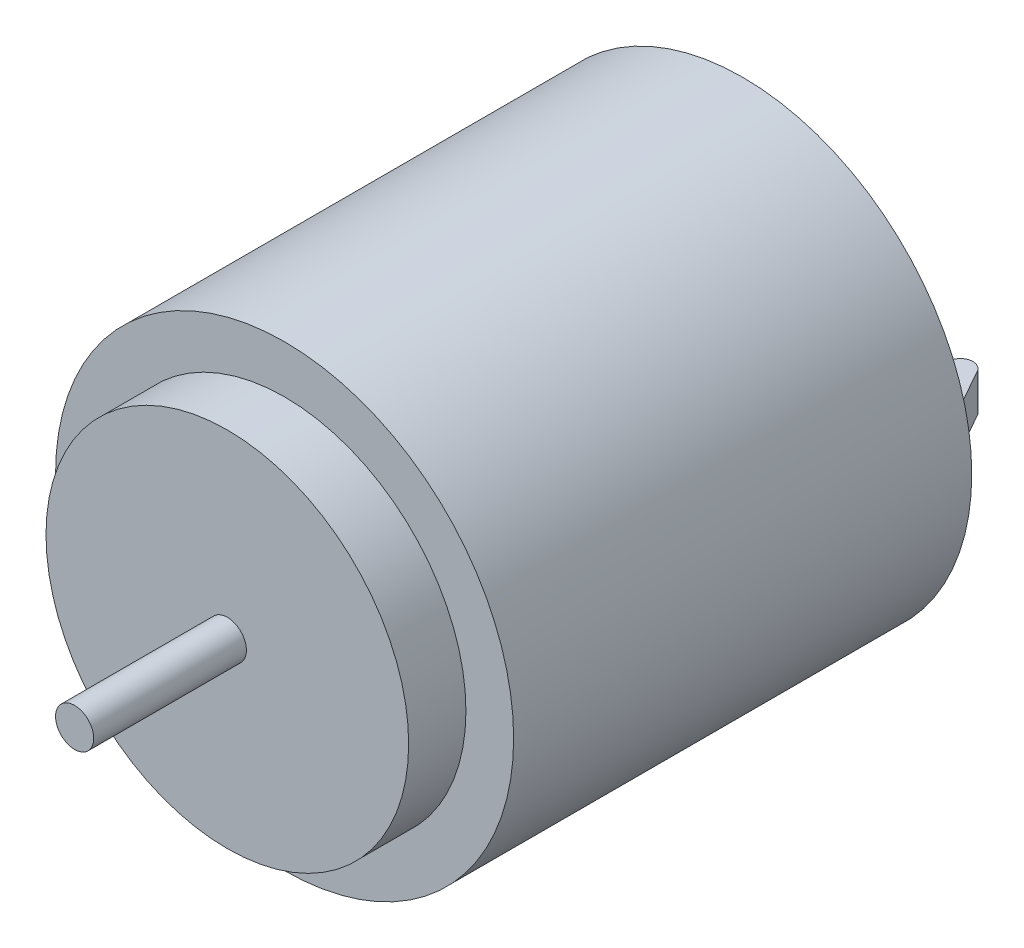
ISO-10303-21;
HEADER;
FILE_DESCRIPTION(('STEP AP214'),'2;1');
FILE_NAME('part.step','',(''),(''),'','','');
FILE_SCHEMA(('AUTOMOTIVE_DESIGN { 1 0 10303 214 1 1 1 1 }'));
ENDSEC;
DATA;
#1=APPLICATION_CONTEXT('core data for automotive mechanical design processes');
#2=APPLICATION_PROTOCOL_DEFINITION('international standard','automotive_design',2000,#1);
#3=PRODUCT_CONTEXT('',#1,'mechanical');
#4=PRODUCT('Part','Part','',(#3));
#5=PRODUCT_RELATED_PRODUCT_CATEGORY('part','',(#4));
#6=PRODUCT_DEFINITION_FORMATION('','',#4);
#7=PRODUCT_DEFINITION_CONTEXT('part definition',#1,'design');
#8=PRODUCT_DEFINITION('design','',#6,#7);
#9=PRODUCT_DEFINITION_SHAPE('','',#8);
#10=(LENGTH_UNIT() NAMED_UNIT(*) SI_UNIT(.MILLI.,.METRE.));
#11=(NAMED_UNIT(*) PLANE_ANGLE_UNIT() SI_UNIT($,.RADIAN.));
#12=(NAMED_UNIT(*) SI_UNIT($,.STERADIAN.) SOLID_ANGLE_UNIT());
#13=UNCERTAINTY_MEASURE_WITH_UNIT(LENGTH_MEASURE(1.E-05),#10,'distance_accuracy_value','');
#14=(GEOMETRIC_REPRESENTATION_CONTEXT(3) GLOBAL_UNCERTAINTY_ASSIGNED_CONTEXT((#13)) GLOBAL_UNIT_ASSIGNED_CONTEXT((#10,
#11,#12)) REPRESENTATION_CONTEXT('',''));
#15=CARTESIAN_POINT('',(0.,0.,0.));
#16=DIRECTION('',(0.,0.,1.));
#17=DIRECTION('',(1.,0.,0.));
#18=AXIS2_PLACEMENT_3D('',#15,#16,#17);
#19=CARTESIAN_POINT('',(0.,0.,-15.6068218615443));
#20=DIRECTION('',(0.,0.,-1.));
#21=DIRECTION('',(-1.,0.,0.));
#22=AXIS2_PLACEMENT_3D('',#19,#20,#21);
#23=PLANE('',#22);
#24=DIRECTION('',(1.,0.,0.));
#25=VECTOR('',#24,1.);
#26=CARTESIAN_POINT('',(0.,1.,-15.6068218615443));
#27=LINE('',#26,#25);
#28=CARTESIAN_POINT('',(9.11430818320881,1.,-15.6068218615443));
#29=VERTEX_POINT('',#28);
#30=CARTESIAN_POINT('',(10.5082613397607,1.,-15.6068218615443));
#31=VERTEX_POINT('',#30);
#32=EDGE_CURVE('E196',#29,#31,#27,.T.);
#33=ORIENTED_EDGE('',*,*,#32,.F.);
#34=DIRECTION('',(0.,-1.,0.));
#35=VECTOR('',#34,1.);
#36=CARTESIAN_POINT('',(9.11430818320881,0.,-15.6068218615443));
#37=LINE('',#36,#35);
#38=CARTESIAN_POINT('',(9.11430818320881,-1.,-15.6068218615443));
#39=VERTEX_POINT('',#38);
#40=EDGE_CURVE('E190',#29,#39,#37,.T.);
#41=ORIENTED_EDGE('',*,*,#40,.T.);
#42=DIRECTION('',(1.,0.,0.));
#43=VECTOR('',#42,1.);
#44=CARTESIAN_POINT('',(0.,-1.,-15.6068218615443));
#45=LINE('',#44,#43);
#46=CARTESIAN_POINT('',(10.5082613397607,-1.,-15.6068218615443));
#47=VERTEX_POINT('',#46);
#48=EDGE_CURVE('E187',#39,#47,#45,.T.);
#49=ORIENTED_EDGE('',*,*,#48,.T.);
#50=DIRECTION('',(0.,-1.,0.));
#51=VECTOR('',#50,1.);
#52=CARTESIAN_POINT('',(10.5082613397607,1.,-15.6068218615443));
#53=LINE('',#52,#51);
#54=EDGE_CURVE('E193',#47,#31,#53,.F.);
#55=ORIENTED_EDGE('',*,*,#54,.T.);
#56=EDGE_LOOP('',(#33,#41,#49,#55));
#57=FACE_BOUND('',#56,.T.);
#58=CARTESIAN_POINT('',(0.,0.,-15.6068218615443));
#59=DIRECTION('',(0.,0.,1.));
#60=DIRECTION('',(1.,0.,0.));
#61=AXIS2_PLACEMENT_3D('',#58,#59,#60);
#62=CIRCLE('',#61,12.);
#63=CARTESIAN_POINT('',(12.,0.,-15.6068218615443));
#64=VERTEX_POINT('',#63);
#65=EDGE_CURVE('E184',#64,#64,#62,.T.);
#66=ORIENTED_EDGE('',*,*,#65,.F.);
#67=EDGE_LOOP('',(#66));
#68=FACE_BOUND('',#67,.T.);
#69=DIRECTION('',(0.,1.,0.));
#70=VECTOR('',#69,1.);
#71=CARTESIAN_POINT('',(-9.11430818320881,0.,-15.6068218615443));
#72=LINE('',#71,#70);
#73=CARTESIAN_POINT('',(-9.11430818320881,-1.,-15.6068218615443));
#74=VERTEX_POINT('',#73);
#75=CARTESIAN_POINT('',(-9.11430818320881,1.,-15.6068218615443));
#76=VERTEX_POINT('',#75);
#77=EDGE_CURVE('E49',#74,#76,#72,.T.);
#78=ORIENTED_EDGE('',*,*,#77,.T.);
#79=DIRECTION('',(-1.,0.,0.));
#80=VECTOR('',#79,1.);
#81=CARTESIAN_POINT('',(0.,1.,-15.6068218615443));
#82=LINE('',#81,#80);
#83=CARTESIAN_POINT('',(-10.5082613397607,1.,-15.6068218615443));
#84=VERTEX_POINT('',#83);
#85=EDGE_CURVE('E11',#76,#84,#82,.T.);
#86=ORIENTED_EDGE('',*,*,#85,.T.);
#87=DIRECTION('',(0.,-1.,0.));
#88=VECTOR('',#87,1.);
#89=CARTESIAN_POINT('',(-10.5082613397607,1.,-15.6068218615443));
#90=LINE('',#89,#88);
#91=CARTESIAN_POINT('',(-10.5082613397607,-1.,-15.6068218615443));
#92=VERTEX_POINT('',#91);
#93=EDGE_CURVE('E39',#84,#92,#90,.T.);
#94=ORIENTED_EDGE('',*,*,#93,.T.);
#95=DIRECTION('',(-1.,0.,0.));
#96=VECTOR('',#95,1.);
#97=CARTESIAN_POINT('',(0.,-1.,-15.6068218615443));
#98=LINE('',#97,#96);
#99=EDGE_CURVE('E198',#74,#92,#98,.T.);
#100=ORIENTED_EDGE('',*,*,#99,.F.);
#101=EDGE_LOOP('',(#78,#86,#94,#100));
#102=FACE_BOUND('',#101,.T.);
#103=ADVANCED_FACE('F32',(#57,#68,#102),#23,.T.);
#104=CARTESIAN_POINT('',(0.,0.,19.3931781384557));
#105=DIRECTION('',(0.,0.,1.));
#106=DIRECTION('',(1.,0.,0.));
#107=AXIS2_PLACEMENT_3D('',#104,#105,#106);
#108=CYLINDRICAL_SURFACE('',#107,12.);
#109=ORIENTED_EDGE('',*,*,#65,.T.);
#110=EDGE_LOOP('',(#109));
#111=FACE_BOUND('',#110,.T.);
#112=CARTESIAN_POINT('',(0.,0.,8.39317813845566));
#113=DIRECTION('',(0.,0.,1.));
#114=DIRECTION('',(1.,0.,0.));
#115=AXIS2_PLACEMENT_3D('',#112,#113,#114);
#116=CIRCLE('',#115,12.);
#117=CARTESIAN_POINT('',(12.,0.,8.39317813845566));
#118=VERTEX_POINT('',#117);
#119=EDGE_CURVE('E181',#118,#118,#116,.T.);
#120=ORIENTED_EDGE('',*,*,#119,.F.);
#121=EDGE_LOOP('',(#120));
#122=FACE_BOUND('',#121,.T.);
#123=ADVANCED_FACE('F221',(#111,#122),#108,.T.);
#124=CARTESIAN_POINT('',(12.,0.,8.39317813845566));
#125=DIRECTION('',(0.,0.,1.));
#126=DIRECTION('',(1.,0.,0.));
#127=AXIS2_PLACEMENT_3D('',#124,#125,#126);
#128=PLANE('',#127);
#129=ORIENTED_EDGE('',*,*,#119,.T.);
#130=EDGE_LOOP('',(#129));
#131=FACE_BOUND('',#130,.T.);
#132=CARTESIAN_POINT('',(0.,0.,8.39317813845566));
#133=DIRECTION('',(0.,0.,1.));
#134=DIRECTION('',(1.,0.,0.));
#135=AXIS2_PLACEMENT_3D('',#132,#133,#134);
#136=CIRCLE('',#135,9.50000000000001);
#137=CARTESIAN_POINT('',(9.50000000000001,0.,8.39317813845566));
#138=VERTEX_POINT('',#137);
#139=EDGE_CURVE('E178',#138,#138,#136,.T.);
#140=ORIENTED_EDGE('',*,*,#139,.F.);
#141=EDGE_LOOP('',(#140));
#142=FACE_BOUND('',#141,.T.);
#143=ADVANCED_FACE('F226',(#131,#142),#128,.T.);
#144=CARTESIAN_POINT('',(0.,0.,19.3931781384557));
#145=DIRECTION('',(0.,0.,1.));
#146=DIRECTION('',(1.,0.,0.));
#147=AXIS2_PLACEMENT_3D('',#144,#145,#146);
#148=CYLINDRICAL_SURFACE('',#147,9.50000000000001);
#149=ORIENTED_EDGE('',*,*,#139,.T.);
#150=EDGE_LOOP('',(#149));
#151=FACE_BOUND('',#150,.T.);
#152=CARTESIAN_POINT('',(0.,0.,11.3931781384557));
#153=DIRECTION('',(0.,0.,1.));
#154=DIRECTION('',(1.,0.,0.));
#155=AXIS2_PLACEMENT_3D('',#152,#153,#154);
#156=CIRCLE('',#155,9.50000000000001);
#157=CARTESIAN_POINT('',(9.50000000000001,0.,11.3931781384557));
#158=VERTEX_POINT('',#157);
#159=EDGE_CURVE('E175',#158,#158,#156,.T.);
#160=ORIENTED_EDGE('',*,*,#159,.F.);
#161=EDGE_LOOP('',(#160));
#162=FACE_BOUND('',#161,.T.);
#163=ADVANCED_FACE('F236',(#151,#162),#148,.T.);
#164=CARTESIAN_POINT('',(9.50000000000001,0.,11.3931781384557));
#165=DIRECTION('',(0.,0.,1.));
#166=DIRECTION('',(1.,0.,0.));
#167=AXIS2_PLACEMENT_3D('',#164,#165,#166);
#168=PLANE('',#167);
#169=ORIENTED_EDGE('',*,*,#159,.T.);
#170=EDGE_LOOP('',(#169));
#171=FACE_BOUND('',#170,.T.);
#172=CARTESIAN_POINT('',(0.,0.,11.3931781384557));
#173=DIRECTION('',(0.,0.,1.));
#174=DIRECTION('',(1.,0.,0.));
#175=AXIS2_PLACEMENT_3D('',#172,#173,#174);
#176=CIRCLE('',#175,1.);
#177=CARTESIAN_POINT('',(1.,0.,11.3931781384557));
#178=VERTEX_POINT('',#177);
#179=EDGE_CURVE('E172',#178,#178,#176,.T.);
#180=ORIENTED_EDGE('',*,*,#179,.F.);
#181=EDGE_LOOP('',(#180));
#182=FACE_BOUND('',#181,.T.);
#183=ADVANCED_FACE('F242',(#171,#182),#168,.T.);
#184=CARTESIAN_POINT('',(0.,0.,19.3931781384557));
#185=DIRECTION('',(0.,0.,1.));
#186=DIRECTION('',(1.,0.,0.));
#187=AXIS2_PLACEMENT_3D('',#184,#185,#186);
#188=CYLINDRICAL_SURFACE('',#187,1.);
#189=ORIENTED_EDGE('',*,*,#179,.T.);
#190=EDGE_LOOP('',(#189));
#191=FACE_BOUND('',#190,.T.);
#192=CARTESIAN_POINT('',(0.,0.,19.3931781384557));
#193=DIRECTION('',(0.,0.,1.));
#194=DIRECTION('',(1.,0.,0.));
#195=AXIS2_PLACEMENT_3D('',#192,#193,#194);
#196=CIRCLE('',#195,1.);
#197=CARTESIAN_POINT('',(1.,0.,19.3931781384557));
#198=VERTEX_POINT('',#197);
#199=EDGE_CURVE('E169',#198,#198,#196,.T.);
#200=ORIENTED_EDGE('',*,*,#199,.F.);
#201=EDGE_LOOP('',(#200));
#202=FACE_BOUND('',#201,.T.);
#203=ADVANCED_FACE('F248',(#191,#202),#188,.T.);
#204=CARTESIAN_POINT('',(1.,0.,19.3931781384557));
#205=DIRECTION('',(0.,0.,1.));
#206=DIRECTION('',(1.,0.,0.));
#207=AXIS2_PLACEMENT_3D('',#204,#205,#206);
#208=PLANE('',#207);
#209=ORIENTED_EDGE('',*,*,#199,.T.);
#210=EDGE_LOOP('',(#209));
#211=FACE_BOUND('',#210,.T.);
#212=ADVANCED_FACE('F254',(#211),#208,.T.);
#213=CARTESIAN_POINT('',(9.85801024992546,1.,-15.6068218615443));
#214=DIRECTION('',(0.,-1.,0.));
#215=DIRECTION('',(0.,0.,-1.));
#216=AXIS2_PLACEMENT_3D('',#213,#214,#215);
#217=CYLINDRICAL_SURFACE('',#216,0.650251089835234);
#218=ORIENTED_EDGE('',*,*,#54,.F.);
#219=CARTESIAN_POINT('',(9.85801024992546,-1.,-15.6068218615443));
#220=DIRECTION('',(0.,1.,0.));
#221=DIRECTION('',(0.,0.,1.));
#222=AXIS2_PLACEMENT_3D('',#219,#220,#221);
#223=CIRCLE('',#222,0.650251089835234);
#224=CARTESIAN_POINT('',(10.4265530828083,-1.,-15.9223936077598));
#225=VERTEX_POINT('',#224);
#226=EDGE_CURVE('E120',#47,#225,#223,.T.);
#227=ORIENTED_EDGE('',*,*,#226,.T.);
#228=DIRECTION('',(0.,-1.,0.));
#229=VECTOR('',#228,1.);
#230=CARTESIAN_POINT('',(10.4265530828083,1.,-15.9223936077598));
#231=LINE('',#230,#229);
#232=CARTESIAN_POINT('',(10.4265530828083,1.,-15.9223936077598));
#233=VERTEX_POINT('',#232);
#234=EDGE_CURVE('E166',#233,#225,#231,.T.);
#235=ORIENTED_EDGE('',*,*,#234,.F.);
#236=CARTESIAN_POINT('',(9.85801024992546,1.,-15.6068218615443));
#237=DIRECTION('',(0.,1.,0.));
#238=DIRECTION('',(0.,0.,1.));
#239=AXIS2_PLACEMENT_3D('',#236,#237,#238);
#240=CIRCLE('',#239,0.650251089835234);
#241=EDGE_CURVE('E143',#31,#233,#240,.T.);
#242=ORIENTED_EDGE('',*,*,#241,.F.);
#243=EDGE_LOOP('',(#218,#227,#235,#242));
#244=FACE_BOUND('',#243,.T.);
#245=ADVANCED_FACE('F259',(#244),#217,.T.);
#246=CARTESIAN_POINT('',(10.4265530828083,1.,-15.9223936077598));
#247=DIRECTION('',(-0.874343529400173,0.,0.485307523737319));
#248=DIRECTION('',(0.485307523737319,0.,0.874343529400173));
#249=AXIS2_PLACEMENT_3D('',#246,#247,#248);
#250=PLANE('',#249);
#251=DIRECTION('',(-0.485307523737319,0.,-0.874343529400173));
#252=VECTOR('',#251,1.);
#253=CARTESIAN_POINT('',(10.4265530828083,-1.,-15.9223936077598));
#254=LINE('',#253,#252);
#255=CARTESIAN_POINT('',(8.49292770934499,-1.,-19.4060668476717));
#256=VERTEX_POINT('',#255);
#257=EDGE_CURVE('E155',#225,#256,#254,.T.);
#258=ORIENTED_EDGE('',*,*,#257,.T.);
#259=DIRECTION('',(0.,-1.,0.));
#260=VECTOR('',#259,1.);
#261=CARTESIAN_POINT('',(8.49292770934499,1.,-19.4060668476717));
#262=LINE('',#261,#260);
#263=CARTESIAN_POINT('',(8.49292770934499,1.,-19.4060668476717));
#264=VERTEX_POINT('',#263);
#265=EDGE_CURVE('E163',#264,#256,#262,.T.);
#266=ORIENTED_EDGE('',*,*,#265,.F.);
#267=DIRECTION('',(-0.485307523737319,0.,-0.874343529400173));
#268=VECTOR('',#267,1.);
#269=CARTESIAN_POINT('',(10.4265530828083,1.,-15.9223936077598));
#270=LINE('',#269,#268);
#271=EDGE_CURVE('E145',#233,#264,#270,.T.);
#272=ORIENTED_EDGE('',*,*,#271,.F.);
#273=ORIENTED_EDGE('',*,*,#234,.T.);
#274=EDGE_LOOP('',(#258,#266,#272,#273));
#275=FACE_BOUND('',#274,.T.);
#276=ADVANCED_FACE('F264',(#275),#250,.F.);
#277=CARTESIAN_POINT('',(7.92438487646215,1.,-19.0904951014563));
#278=DIRECTION('',(0.,-1.,0.));
#279=DIRECTION('',(0.,0.,-1.));
#280=AXIS2_PLACEMENT_3D('',#277,#278,#279);
#281=CYLINDRICAL_SURFACE('',#280,0.650251089835234);
#282=CARTESIAN_POINT('',(7.92438487646215,-1.,-19.0904951014563));
#283=DIRECTION('',(0.,1.,0.));
#284=DIRECTION('',(0.,0.,1.));
#285=AXIS2_PLACEMENT_3D('',#282,#283,#284);
#286=CIRCLE('',#285,0.650251089835234);
#287=CARTESIAN_POINT('',(7.3558420435793,-1.,-18.7749233552409));
#288=VERTEX_POINT('',#287);
#289=EDGE_CURVE('E157',#256,#288,#286,.T.);
#290=ORIENTED_EDGE('',*,*,#289,.T.);
#291=DIRECTION('',(0.,-1.,0.));
#292=VECTOR('',#291,1.);
#293=CARTESIAN_POINT('',(7.3558420435793,1.,-18.7749233552409));
#294=LINE('',#293,#292);
#295=CARTESIAN_POINT('',(7.3558420435793,1.,-18.7749233552409));
#296=VERTEX_POINT('',#295);
#297=EDGE_CURVE('E153',#296,#288,#294,.T.);
#298=ORIENTED_EDGE('',*,*,#297,.F.);
#299=CARTESIAN_POINT('',(7.92438487646215,1.,-19.0904951014563));
#300=DIRECTION('',(0.,1.,0.));
#301=DIRECTION('',(0.,0.,1.));
#302=AXIS2_PLACEMENT_3D('',#299,#300,#301);
#303=CIRCLE('',#302,0.650251089835234);
#304=EDGE_CURVE('E148',#264,#296,#303,.T.);
#305=ORIENTED_EDGE('',*,*,#304,.F.);
#306=ORIENTED_EDGE('',*,*,#265,.T.);
#307=EDGE_LOOP('',(#290,#298,#305,#306));
#308=FACE_BOUND('',#307,.T.);
#309=ADVANCED_FACE('F270',(#308),#281,.T.);
#310=CARTESIAN_POINT('',(9.28946741704261,1.,-15.2912501153289));
#311=DIRECTION('',(0.874343529400173,0.,-0.485307523737319));
#312=DIRECTION('',(-0.485307523737319,0.,-0.874343529400173));
#313=AXIS2_PLACEMENT_3D('',#310,#311,#312);
#314=PLANE('',#313);
#315=ORIENTED_EDGE('',*,*,#40,.F.);
#316=DIRECTION('',(0.485307523737319,0.,0.874343529400173));
#317=VECTOR('',#316,1.);
#318=CARTESIAN_POINT('',(9.28946741704261,1.,-15.2912501153289));
#319=LINE('',#318,#317);
#320=EDGE_CURVE('E150',#296,#29,#319,.T.);
#321=ORIENTED_EDGE('',*,*,#320,.F.);
#322=ORIENTED_EDGE('',*,*,#297,.T.);
#323=DIRECTION('',(0.485307523737319,0.,0.874343529400173));
#324=VECTOR('',#323,1.);
#325=CARTESIAN_POINT('',(9.28946741704261,-1.,-15.2912501153289));
#326=LINE('',#325,#324);
#327=EDGE_CURVE('E146',#288,#39,#326,.T.);
#328=ORIENTED_EDGE('',*,*,#327,.T.);
#329=EDGE_LOOP('',(#315,#321,#322,#328));
#330=FACE_BOUND('',#329,.T.);
#331=ADVANCED_FACE('F274',(#330),#314,.F.);
#332=CARTESIAN_POINT('',(9.85801024992546,1.,-15.6068218615443));
#333=DIRECTION('',(0.,1.,0.));
#334=DIRECTION('',(0.,0.,1.));
#335=AXIS2_PLACEMENT_3D('',#332,#333,#334);
#336=PLANE('',#335);
#337=ORIENTED_EDGE('',*,*,#320,.T.);
#338=ORIENTED_EDGE('',*,*,#32,.T.);
#339=ORIENTED_EDGE('',*,*,#241,.T.);
#340=ORIENTED_EDGE('',*,*,#271,.T.);
#341=ORIENTED_EDGE('',*,*,#304,.T.);
#342=EDGE_LOOP('',(#337,#338,#339,#340,#341));
#343=FACE_BOUND('',#342,.T.);
#344=ADVANCED_FACE('F278',(#343),#336,.T.);
#345=CARTESIAN_POINT('',(9.85801024992546,-1.,-15.6068218615443));
#346=DIRECTION('',(0.,1.,0.));
#347=DIRECTION('',(0.,0.,1.));
#348=AXIS2_PLACEMENT_3D('',#345,#346,#347);
#349=PLANE('',#348);
#350=ORIENTED_EDGE('',*,*,#48,.F.);
#351=ORIENTED_EDGE('',*,*,#327,.F.);
#352=ORIENTED_EDGE('',*,*,#289,.F.);
#353=ORIENTED_EDGE('',*,*,#257,.F.);
#354=ORIENTED_EDGE('',*,*,#226,.F.);
#355=EDGE_LOOP('',(#350,#351,#352,#353,#354));
#356=FACE_BOUND('',#355,.T.);
#357=ADVANCED_FACE('F280',(#356),#349,.F.);
#358=CARTESIAN_POINT('',(-9.85801024992546,1.,-15.6068218615443));
#359=DIRECTION('',(0.,-1.,0.));
#360=DIRECTION('',(0.,0.,-1.));
#361=AXIS2_PLACEMENT_3D('',#358,#359,#360);
#362=CYLINDRICAL_SURFACE('',#361,0.650251089835234);
#363=ORIENTED_EDGE('',*,*,#93,.F.);
#364=CARTESIAN_POINT('',(-9.85801024992546,1.,-15.6068218615443));
#365=DIRECTION('',(0.,1.,0.));
#366=DIRECTION('',(0.,0.,-1.));
#367=AXIS2_PLACEMENT_3D('',#364,#365,#366);
#368=CIRCLE('',#367,0.650251089835234);
#369=CARTESIAN_POINT('',(-10.4265530828083,1.,-15.9223936077598));
#370=VERTEX_POINT('',#369);
#371=EDGE_CURVE('E111',#370,#84,#368,.T.);
#372=ORIENTED_EDGE('',*,*,#371,.F.);
#373=DIRECTION('',(0.,-1.,0.));
#374=VECTOR('',#373,1.);
#375=CARTESIAN_POINT('',(-10.4265530828083,1.,-15.9223936077598));
#376=LINE('',#375,#374);
#377=CARTESIAN_POINT('',(-10.4265530828083,-1.,-15.9223936077598));
#378=VERTEX_POINT('',#377);
#379=EDGE_CURVE('E128',#370,#378,#376,.T.);
#380=ORIENTED_EDGE('',*,*,#379,.T.);
#381=CARTESIAN_POINT('',(-9.85801024992546,-1.,-15.6068218615443));
#382=DIRECTION('',(0.,1.,0.));
#383=DIRECTION('',(0.,0.,-1.));
#384=AXIS2_PLACEMENT_3D('',#381,#382,#383);
#385=CIRCLE('',#384,0.650251089835234);
#386=EDGE_CURVE('E132',#378,#92,#385,.T.);
#387=ORIENTED_EDGE('',*,*,#386,.T.);
#388=EDGE_LOOP('',(#363,#372,#380,#387));
#389=FACE_BOUND('',#388,.T.);
#390=ADVANCED_FACE('F207',(#389),#362,.T.);
#391=CARTESIAN_POINT('',(-9.28946741704261,1.,-15.2912501153289));
#392=DIRECTION('',(-0.874343529400173,0.,-0.485307523737319));
#393=DIRECTION('',(-0.485307523737319,0.,0.874343529400173));
#394=AXIS2_PLACEMENT_3D('',#391,#392,#393);
#395=PLANE('',#394);
#396=ORIENTED_EDGE('',*,*,#77,.F.);
#397=DIRECTION('',(0.485307523737319,0.,-0.874343529400173));
#398=VECTOR('',#397,1.);
#399=CARTESIAN_POINT('',(-9.28946741704261,-1.,-15.2912501153289));
#400=LINE('',#399,#398);
#401=CARTESIAN_POINT('',(-7.3558420435793,-1.,-18.7749233552409));
#402=VERTEX_POINT('',#401);
#403=EDGE_CURVE('E117',#74,#402,#400,.T.);
#404=ORIENTED_EDGE('',*,*,#403,.T.);
#405=DIRECTION('',(0.,-1.,0.));
#406=VECTOR('',#405,1.);
#407=CARTESIAN_POINT('',(-7.3558420435793,1.,-18.7749233552409));
#408=LINE('',#407,#406);
#409=CARTESIAN_POINT('',(-7.3558420435793,1.,-18.7749233552409));
#410=VERTEX_POINT('',#409);
#411=EDGE_CURVE('E114',#410,#402,#408,.T.);
#412=ORIENTED_EDGE('',*,*,#411,.F.);
#413=DIRECTION('',(0.485307523737319,0.,-0.874343529400173));
#414=VECTOR('',#413,1.);
#415=CARTESIAN_POINT('',(-9.28946741704261,1.,-15.2912501153289));
#416=LINE('',#415,#414);
#417=EDGE_CURVE('E103',#76,#410,#416,.T.);
#418=ORIENTED_EDGE('',*,*,#417,.F.);
#419=EDGE_LOOP('',(#396,#404,#412,#418));
#420=FACE_BOUND('',#419,.T.);
#421=ADVANCED_FACE('F115',(#420),#395,.F.);
#422=CARTESIAN_POINT('',(-7.92438487646215,1.,-19.0904951014563));
#423=DIRECTION('',(0.,-1.,0.));
#424=DIRECTION('',(0.,0.,-1.));
#425=AXIS2_PLACEMENT_3D('',#422,#423,#424);
#426=CYLINDRICAL_SURFACE('',#425,0.650251089835234);
#427=CARTESIAN_POINT('',(-7.92438487646215,-1.,-19.0904951014563));
#428=DIRECTION('',(0.,1.,0.));
#429=DIRECTION('',(0.,0.,-1.));
#430=AXIS2_PLACEMENT_3D('',#427,#428,#429);
#431=CIRCLE('',#430,0.650251089835234);
#432=CARTESIAN_POINT('',(-8.49292770934499,-1.,-19.4060668476717));
#433=VERTEX_POINT('',#432);
#434=EDGE_CURVE('E136',#402,#433,#431,.T.);
#435=ORIENTED_EDGE('',*,*,#434,.T.);
#436=DIRECTION('',(0.,-1.,0.));
#437=VECTOR('',#436,1.);
#438=CARTESIAN_POINT('',(-8.49292770934499,1.,-19.4060668476717));
#439=LINE('',#438,#437);
#440=CARTESIAN_POINT('',(-8.49292770934499,1.,-19.4060668476717));
#441=VERTEX_POINT('',#440);
#442=EDGE_CURVE('E121',#441,#433,#439,.T.);
#443=ORIENTED_EDGE('',*,*,#442,.F.);
#444=CARTESIAN_POINT('',(-7.92438487646215,1.,-19.0904951014563));
#445=DIRECTION('',(0.,1.,0.));
#446=DIRECTION('',(0.,0.,-1.));
#447=AXIS2_PLACEMENT_3D('',#444,#445,#446);
#448=CIRCLE('',#447,0.650251089835234);
#449=EDGE_CURVE('E107',#410,#441,#448,.T.);
#450=ORIENTED_EDGE('',*,*,#449,.F.);
#451=ORIENTED_EDGE('',*,*,#411,.T.);
#452=EDGE_LOOP('',(#435,#443,#450,#451));
#453=FACE_BOUND('',#452,.T.);
#454=ADVANCED_FACE('F123',(#453),#426,.T.);
#455=CARTESIAN_POINT('',(-10.4265530828083,1.,-15.9223936077598));
#456=DIRECTION('',(0.874343529400173,0.,0.485307523737319));
#457=DIRECTION('',(0.485307523737319,0.,-0.874343529400173));
#458=AXIS2_PLACEMENT_3D('',#455,#456,#457);
#459=PLANE('',#458);
#460=DIRECTION('',(-0.485307523737319,0.,0.874343529400173));
#461=VECTOR('',#460,1.);
#462=CARTESIAN_POINT('',(-10.4265530828083,-1.,-15.9223936077598));
#463=LINE('',#462,#461);
#464=EDGE_CURVE('E138',#433,#378,#463,.T.);
#465=ORIENTED_EDGE('',*,*,#464,.T.);
#466=ORIENTED_EDGE('',*,*,#379,.F.);
#467=DIRECTION('',(-0.485307523737319,0.,0.874343529400173));
#468=VECTOR('',#467,1.);
#469=CARTESIAN_POINT('',(-10.4265530828083,1.,-15.9223936077598));
#470=LINE('',#469,#468);
#471=EDGE_CURVE('E126',#441,#370,#470,.T.);
#472=ORIENTED_EDGE('',*,*,#471,.F.);
#473=ORIENTED_EDGE('',*,*,#442,.T.);
#474=EDGE_LOOP('',(#465,#466,#472,#473));
#475=FACE_BOUND('',#474,.T.);
#476=ADVANCED_FACE('F210',(#475),#459,.F.);
#477=CARTESIAN_POINT('',(-9.85801024992546,1.,-15.6068218615443));
#478=DIRECTION('',(0.,-1.,0.));
#479=DIRECTION('',(0.,0.,-1.));
#480=AXIS2_PLACEMENT_3D('',#477,#478,#479);
#481=PLANE('',#480);
#482=ORIENTED_EDGE('',*,*,#85,.F.);
#483=ORIENTED_EDGE('',*,*,#417,.T.);
#484=ORIENTED_EDGE('',*,*,#449,.T.);
#485=ORIENTED_EDGE('',*,*,#471,.T.);
#486=ORIENTED_EDGE('',*,*,#371,.T.);
#487=EDGE_LOOP('',(#482,#483,#484,#485,#486));
#488=FACE_BOUND('',#487,.T.);
#489=ADVANCED_FACE('F105',(#488),#481,.F.);
#490=CARTESIAN_POINT('',(-9.85801024992546,-1.,-15.6068218615443));
#491=DIRECTION('',(0.,-1.,0.));
#492=DIRECTION('',(0.,0.,-1.));
#493=AXIS2_PLACEMENT_3D('',#490,#491,#492);
#494=PLANE('',#493);
#495=ORIENTED_EDGE('',*,*,#403,.F.);
#496=ORIENTED_EDGE('',*,*,#99,.T.);
#497=ORIENTED_EDGE('',*,*,#386,.F.);
#498=ORIENTED_EDGE('',*,*,#464,.F.);
#499=ORIENTED_EDGE('',*,*,#434,.F.);
#500=EDGE_LOOP('',(#495,#496,#497,#498,#499));
#501=FACE_BOUND('',#500,.T.);
#502=ADVANCED_FACE('F205',(#501),#494,.T.);
#503=CLOSED_SHELL('',(#103,#123,#143,#163,#183,#203,#212,#245,#276,#309,#331,#344,#357,#390,
#421,#454,#476,#489,#502));
#504=MANIFOLD_SOLID_BREP('B2',#503);
#505=ADVANCED_BREP_SHAPE_REPRESENTATION('',(#18,#504),#14);
#506=SHAPE_DEFINITION_REPRESENTATION(#9,#505);
ENDSEC;
END-ISO-10303-21;
